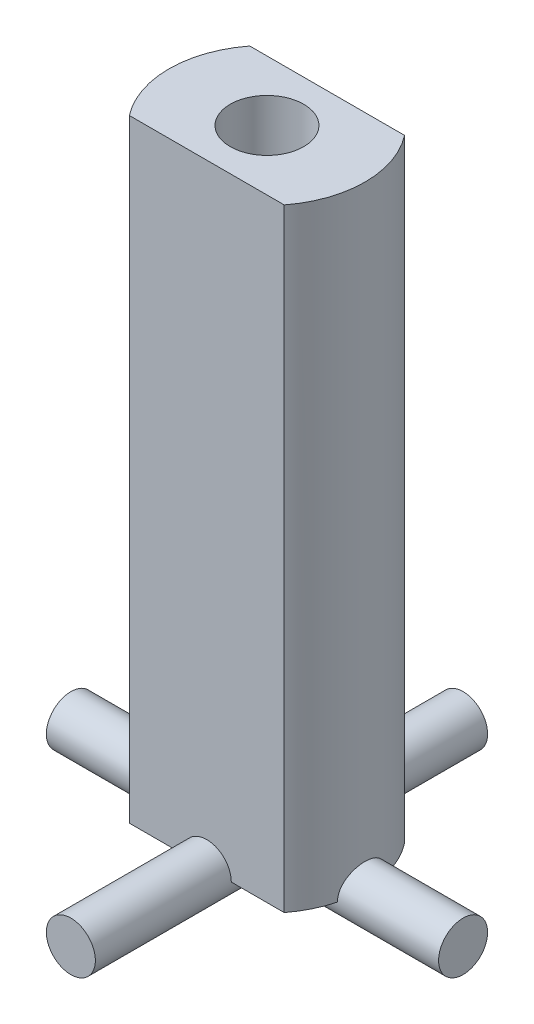
ISO-10303-21;
HEADER;
FILE_DESCRIPTION(('STEP AP214'),'2;1');
FILE_NAME('part.step','',(''),(''),'','','');
FILE_SCHEMA(('AUTOMOTIVE_DESIGN { 1 0 10303 214 1 1 1 1 }'));
ENDSEC;
DATA;
#1=APPLICATION_CONTEXT('core data for automotive mechanical design processes');
#2=APPLICATION_PROTOCOL_DEFINITION('international standard','automotive_design',2000,#1);
#3=PRODUCT_CONTEXT('',#1,'mechanical');
#4=PRODUCT('Part','Part','',(#3));
#5=PRODUCT_RELATED_PRODUCT_CATEGORY('part','',(#4));
#6=PRODUCT_DEFINITION_FORMATION('','',#4);
#7=PRODUCT_DEFINITION_CONTEXT('part definition',#1,'design');
#8=PRODUCT_DEFINITION('design','',#6,#7);
#9=PRODUCT_DEFINITION_SHAPE('','',#8);
#10=(LENGTH_UNIT() NAMED_UNIT(*) SI_UNIT(.MILLI.,.METRE.));
#11=(NAMED_UNIT(*) PLANE_ANGLE_UNIT() SI_UNIT($,.RADIAN.));
#12=(NAMED_UNIT(*) SI_UNIT($,.STERADIAN.) SOLID_ANGLE_UNIT());
#13=UNCERTAINTY_MEASURE_WITH_UNIT(LENGTH_MEASURE(1.E-05),#10,'distance_accuracy_value','');
#14=(GEOMETRIC_REPRESENTATION_CONTEXT(3) GLOBAL_UNCERTAINTY_ASSIGNED_CONTEXT((#13)) GLOBAL_UNIT_ASSIGNED_CONTEXT((#10,
#11,#12)) REPRESENTATION_CONTEXT('',''));
#15=CARTESIAN_POINT('',(0.,0.,0.));
#16=DIRECTION('',(0.,0.,1.));
#17=DIRECTION('',(1.,0.,0.));
#18=AXIS2_PLACEMENT_3D('',#15,#16,#17);
#19=CARTESIAN_POINT('',(0.,0.,0.));
#20=DIRECTION('',(0.,1.,0.));
#21=DIRECTION('',(0.,0.,1.));
#22=AXIS2_PLACEMENT_3D('',#19,#20,#21);
#23=PLANE('',#22);
#24=CARTESIAN_POINT('',(0.,0.,0.));
#25=DIRECTION('',(0.,1.,0.));
#26=DIRECTION('',(0.,0.,1.));
#27=AXIS2_PLACEMENT_3D('',#24,#25,#26);
#28=CIRCLE('',#27,2.);
#29=CARTESIAN_POINT('',(-1.93649167310371,0.,0.5));
#30=VERTEX_POINT('',#29);
#31=CARTESIAN_POINT('',(-1.57882487883139,0.,1.22772635468294));
#32=VERTEX_POINT('',#31);
#33=EDGE_CURVE('E146',#30,#32,#28,.T.);
#34=ORIENTED_EDGE('',*,*,#33,.F.);
#35=DIRECTION('',(1.,0.,0.));
#36=VECTOR('',#35,1.);
#37=CARTESIAN_POINT('',(-4.,0.,0.5));
#38=LINE('',#37,#36);
#39=CARTESIAN_POINT('',(-0.5,0.,0.5));
#40=VERTEX_POINT('',#39);
#41=EDGE_CURVE('E209',#30,#40,#38,.T.);
#42=ORIENTED_EDGE('',*,*,#41,.T.);
#43=DIRECTION('',(0.,0.,1.));
#44=VECTOR('',#43,1.);
#45=CARTESIAN_POINT('',(-0.5,0.,-4.));
#46=LINE('',#45,#44);
#47=CARTESIAN_POINT('',(-0.5,0.,1.22772635468294));
#48=VERTEX_POINT('',#47);
#49=EDGE_CURVE('E125',#40,#48,#46,.T.);
#50=ORIENTED_EDGE('',*,*,#49,.T.);
#51=DIRECTION('',(1.,0.,0.));
#52=VECTOR('',#51,1.);
#53=CARTESIAN_POINT('',(-1.57882487883139,0.,1.22772635468294));
#54=LINE('',#53,#52);
#55=EDGE_CURVE('E135',#32,#48,#54,.T.);
#56=ORIENTED_EDGE('',*,*,#55,.F.);
#57=EDGE_LOOP('',(#34,#42,#50,#56));
#58=FACE_BOUND('',#57,.T.);
#59=ADVANCED_FACE('F33',(#58),#23,.F.);
#60=DIRECTION('',(0.,0.,1.));
#61=VECTOR('',#60,1.);
#62=CARTESIAN_POINT('',(0.5,0.,-4.));
#63=LINE('',#62,#61);
#64=CARTESIAN_POINT('',(0.5,0.,1.22772635468294));
#65=VERTEX_POINT('',#64);
#66=CARTESIAN_POINT('',(0.5,0.,0.5));
#67=VERTEX_POINT('',#66);
#68=EDGE_CURVE('E116',#65,#67,#63,.F.);
#69=ORIENTED_EDGE('',*,*,#68,.T.);
#70=DIRECTION('',(1.,0.,0.));
#71=VECTOR('',#70,1.);
#72=CARTESIAN_POINT('',(-4.,0.,0.5));
#73=LINE('',#72,#71);
#74=CARTESIAN_POINT('',(1.93649167310371,0.,0.5));
#75=VERTEX_POINT('',#74);
#76=EDGE_CURVE('E194',#67,#75,#73,.T.);
#77=ORIENTED_EDGE('',*,*,#76,.T.);
#78=CARTESIAN_POINT('',(0.,0.,0.));
#79=DIRECTION('',(0.,1.,0.));
#80=DIRECTION('',(0.,0.,1.));
#81=AXIS2_PLACEMENT_3D('',#78,#79,#80);
#82=CIRCLE('',#81,2.);
#83=CARTESIAN_POINT('',(1.57882487883139,0.,1.22772635468294));
#84=VERTEX_POINT('',#83);
#85=EDGE_CURVE('E142',#84,#75,#82,.T.);
#86=ORIENTED_EDGE('',*,*,#85,.F.);
#87=EDGE_CURVE('E131',#65,#84,#54,.T.);
#88=ORIENTED_EDGE('',*,*,#87,.F.);
#89=EDGE_LOOP('',(#69,#77,#86,#88));
#90=FACE_BOUND('',#89,.T.);
#91=ADVANCED_FACE('F140',(#90),#23,.F.);
#92=CARTESIAN_POINT('',(0.,0.,-4.));
#93=DIRECTION('',(0.,0.,1.));
#94=DIRECTION('',(1.,0.,0.));
#95=AXIS2_PLACEMENT_3D('',#92,#93,#94);
#96=CYLINDRICAL_SURFACE('',#95,0.5);
#97=CARTESIAN_POINT('',(0.,0.,0.));
#98=DIRECTION('',(0.707106781186547,0.,0.707106781186547));
#99=DIRECTION('',(-0.707106781186547,0.,0.707106781186547));
#100=AXIS2_PLACEMENT_3D('',#97,#98,#99);
#101=ELLIPSE('',#100,0.707106781186547,0.5);
#102=CARTESIAN_POINT('',(0.,-0.5,0.));
#103=VERTEX_POINT('',#102);
#104=EDGE_CURVE('E11',#103,#40,#101,.F.);
#105=ORIENTED_EDGE('',*,*,#104,.F.);
#106=CARTESIAN_POINT('',(0.,0.,0.));
#107=DIRECTION('',(-0.707106781186547,0.,0.707106781186547));
#108=DIRECTION('',(0.707106781186547,0.,0.707106781186547));
#109=AXIS2_PLACEMENT_3D('',#106,#107,#108);
#110=ELLIPSE('',#109,0.707106781186547,0.5);
#111=EDGE_CURVE('E49',#67,#103,#110,.F.);
#112=ORIENTED_EDGE('',*,*,#111,.F.);
#113=ORIENTED_EDGE('',*,*,#68,.F.);
#114=CARTESIAN_POINT('',(0.,0.,1.22772635468294));
#115=DIRECTION('',(0.,0.,-1.));
#116=DIRECTION('',(-1.,0.,0.));
#117=AXIS2_PLACEMENT_3D('',#114,#115,#116);
#118=CIRCLE('',#117,0.5);
#119=EDGE_CURVE('E121',#48,#65,#118,.T.);
#120=ORIENTED_EDGE('',*,*,#119,.F.);
#121=ORIENTED_EDGE('',*,*,#49,.F.);
#122=EDGE_LOOP('',(#105,#112,#113,#120,#121));
#123=FACE_BOUND('',#122,.T.);
#124=CARTESIAN_POINT('',(0.,0.,4.));
#125=DIRECTION('',(0.,0.,1.));
#126=DIRECTION('',(1.,0.,0.));
#127=AXIS2_PLACEMENT_3D('',#124,#125,#126);
#128=CIRCLE('',#127,0.5);
#129=CARTESIAN_POINT('',(0.5,0.,4.));
#130=VERTEX_POINT('',#129);
#131=EDGE_CURVE('E264',#130,#130,#128,.T.);
#132=ORIENTED_EDGE('',*,*,#131,.F.);
#133=EDGE_LOOP('',(#132));
#134=FACE_BOUND('',#133,.T.);
#135=ADVANCED_FACE('F118',(#123,#134),#96,.T.);
#136=CARTESIAN_POINT('',(-0.5,0.,-1.22772635468294));
#137=VERTEX_POINT('',#136);
#138=CARTESIAN_POINT('',(-0.5,0.,-0.5));
#139=VERTEX_POINT('',#138);
#140=EDGE_CURVE('E167',#137,#139,#46,.T.);
#141=ORIENTED_EDGE('',*,*,#140,.T.);
#142=DIRECTION('',(1.,0.,0.));
#143=VECTOR('',#142,1.);
#144=CARTESIAN_POINT('',(-4.,0.,-0.5));
#145=LINE('',#144,#143);
#146=CARTESIAN_POINT('',(-1.93649167310371,0.,-0.5));
#147=VERTEX_POINT('',#146);
#148=EDGE_CURVE('E188',#139,#147,#145,.F.);
#149=ORIENTED_EDGE('',*,*,#148,.T.);
#150=CARTESIAN_POINT('',(-1.57882487883139,0.,-1.22772635468294));
#151=VERTEX_POINT('',#150);
#152=EDGE_CURVE('E143',#151,#147,#28,.T.);
#153=ORIENTED_EDGE('',*,*,#152,.F.);
#154=DIRECTION('',(-1.,0.,0.));
#155=VECTOR('',#154,1.);
#156=CARTESIAN_POINT('',(-1.57882487883139,0.,-1.22772635468294));
#157=LINE('',#156,#155);
#158=EDGE_CURVE('E151',#137,#151,#157,.T.);
#159=ORIENTED_EDGE('',*,*,#158,.F.);
#160=EDGE_LOOP('',(#141,#149,#153,#159));
#161=FACE_BOUND('',#160,.T.);
#162=ADVANCED_FACE('F246',(#161),#23,.F.);
#163=CARTESIAN_POINT('',(0.,12.5,0.));
#164=DIRECTION('',(0.,-1.,0.));
#165=DIRECTION('',(0.,0.,-1.));
#166=AXIS2_PLACEMENT_3D('',#163,#164,#165);
#167=CYLINDRICAL_SURFACE('',#166,2.);
#168=ORIENTED_EDGE('',*,*,#152,.T.);
#169=CARTESIAN_POINT('',(-1.93649167310371,0.,-0.5));
#170=CARTESIAN_POINT('',(-1.93646809909124,0.0276614121562544,-0.500025906431621));
#171=CARTESIAN_POINT('',(-1.93708375592469,0.0553055042815103,-0.497706322777899));
#172=CARTESIAN_POINT('',(-1.93941464849821,0.109739887238544,-0.488579665597411));
#173=CARTESIAN_POINT('',(-1.9411276483262,0.136531798195898,-0.481781716252031));
#174=CARTESIAN_POINT('',(-1.945475480511,0.188558773268007,-0.463901169259005));
#175=CARTESIAN_POINT('',(-1.94811022623865,0.213793983425288,-0.45281897425066));
#176=CARTESIAN_POINT('',(-1.95399611118734,0.262056680112295,-0.426707117448015));
#177=CARTESIAN_POINT('',(-1.95724741562981,0.28508357237504,-0.411676397136426));
#178=CARTESIAN_POINT('',(-1.96408119100223,0.328771677436081,-0.377742393498038));
#179=CARTESIAN_POINT('',(-1.96766892270874,0.349377372476071,-0.358768676638937));
#180=CARTESIAN_POINT('',(-1.97472555442199,0.387151115399325,-0.317637848004419));
#181=CARTESIAN_POINT('',(-1.97819443536059,0.404318613787283,-0.295480228345473));
#182=CARTESIAN_POINT('',(-1.98468090254635,0.434955481490317,-0.248228461253673));
#183=CARTESIAN_POINT('',(-1.98769152103382,0.448369942819498,-0.223097673260402));
#184=CARTESIAN_POINT('',(-1.99286173362731,0.470762372269824,-0.170851292328903));
#185=CARTESIAN_POINT('',(-1.99502149520363,0.479741213522365,-0.143736091220776));
#186=CARTESIAN_POINT('',(-1.99820949940827,0.492829495044053,-0.0888720550666934));
#187=CARTESIAN_POINT('',(-1.99925976434121,0.497033835851399,-0.061147161216717));
#188=CARTESIAN_POINT('',(-2.00018719091935,0.500751686131614,-0.00536638762557865));
#189=CARTESIAN_POINT('',(-2.00006450001105,0.500265785191619,0.0226894500714319));
#190=CARTESIAN_POINT('',(-1.99867618678583,0.494685018063944,0.0776762464302359));
#191=CARTESIAN_POINT('',(-1.99743599337532,0.489692691675245,0.104618350854968));
#192=CARTESIAN_POINT('',(-1.99398165319397,0.475405660433644,0.15726935555713));
#193=CARTESIAN_POINT('',(-1.99176746333087,0.466110765222443,0.182978201216019));
#194=CARTESIAN_POINT('',(-1.98657498880587,0.443399359657882,0.232703643008207));
#195=CARTESIAN_POINT('',(-1.98358996913694,0.429946302881758,0.256702814800034));
#196=CARTESIAN_POINT('',(-1.97717972771043,0.39932843508509,0.302138315616097));
#197=CARTESIAN_POINT('',(-1.97375443966622,0.382163064873885,0.32357425778144));
#198=CARTESIAN_POINT('',(-1.96672783011409,0.344060543958837,0.363884694853942));
#199=CARTESIAN_POINT('',(-1.96312425238837,0.323034181729958,0.382674551526982));
#200=CARTESIAN_POINT('',(-1.95623084142009,0.27808506653627,0.4164847875932));
#201=CARTESIAN_POINT('',(-1.95294109421498,0.254161523358256,0.431504135122553));
#202=CARTESIAN_POINT('',(-1.94703906793161,0.203927201088081,0.457402354642959));
#203=CARTESIAN_POINT('',(-1.94443053004568,0.177604267551949,0.468258508943629));
#204=CARTESIAN_POINT('',(-1.94023529403528,0.123441535790868,0.48535117592492));
#205=CARTESIAN_POINT('',(-1.93864706880718,0.0956040724250813,0.491594594606067));
#206=CARTESIAN_POINT('',(-1.93727645340762,0.056271309620548,0.496952317575468));
#207=CARTESIAN_POINT('',(-1.9369826155543,0.0450401483934094,0.498095395483354));
#208=CARTESIAN_POINT('',(-1.93659031244487,0.0225411050453399,0.499618378848697));
#209=CARTESIAN_POINT('',(-1.93649153109731,0.0112733120223556,0.499999519048023));
#210=CARTESIAN_POINT('',(-1.93649167310371,0.,0.5));
#211=B_SPLINE_CURVE_WITH_KNOTS('',3,(#169,#170,#171,#172,#173,#174,#175,#176,#177,#178,#179,
#180,#181,#182,#183,#184,#185,#186,#187,#188,#189,#190,#191,#192,#193,#194,#195,#196,#197,#198,
#199,#200,#201,#202,#203,#204,#205,#206,#207,#208,#209,#210),.UNSPECIFIED.,.F.,.F.,(4,2,2,2,2,2,
2,2,2,2,2,2,2,2,2,2,2,2,2,2,4),(0.,0.0828537139949826,0.165539142492815,0.248216801988721,
0.330916648299366,0.415245109649978,0.499587037705587,0.585105096427164,0.670606314598113,
0.754376568512614,0.838136292219185,0.920036888332368,1.00194110831518,1.08458670818787,
1.16724476575763,1.2521313086087,1.33704105684083,1.42240776174133,1.50764639863592,
1.54150340454923,1.57530549959435),.UNSPECIFIED.);
#212=EDGE_CURVE('E57',#147,#30,#211,.T.);
#213=ORIENTED_EDGE('',*,*,#212,.T.);
#214=ORIENTED_EDGE('',*,*,#33,.T.);
#215=DIRECTION('',(0.,-1.,0.));
#216=VECTOR('',#215,1.);
#217=CARTESIAN_POINT('',(-1.57882487883139,12.5,1.22772635468294));
#218=LINE('',#217,#216);
#219=CARTESIAN_POINT('',(-1.57882487883139,12.5,1.22772635468294));
#220=VERTEX_POINT('',#219);
#221=EDGE_CURVE('E165',#220,#32,#218,.T.);
#222=ORIENTED_EDGE('',*,*,#221,.F.);
#223=CARTESIAN_POINT('',(0.,12.5,0.));
#224=DIRECTION('',(0.,1.,0.));
#225=DIRECTION('',(0.,0.,1.));
#226=AXIS2_PLACEMENT_3D('',#223,#224,#225);
#227=CIRCLE('',#226,2.);
#228=CARTESIAN_POINT('',(-1.57882487883139,12.5,-1.22772635468294));
#229=VERTEX_POINT('',#228);
#230=EDGE_CURVE('E155',#229,#220,#227,.T.);
#231=ORIENTED_EDGE('',*,*,#230,.F.);
#232=DIRECTION('',(0.,-1.,0.));
#233=VECTOR('',#232,1.);
#234=CARTESIAN_POINT('',(-1.57882487883139,12.5,-1.22772635468294));
#235=LINE('',#234,#233);
#236=EDGE_CURVE('E156',#229,#151,#235,.T.);
#237=ORIENTED_EDGE('',*,*,#236,.T.);
#238=EDGE_LOOP('',(#168,#213,#214,#222,#231,#237));
#239=FACE_BOUND('',#238,.T.);
#240=ADVANCED_FACE('F35',(#239),#167,.T.);
#241=CARTESIAN_POINT('',(-1.57882487883139,12.5,1.22772635468294));
#242=DIRECTION('',(0.,0.,-1.));
#243=DIRECTION('',(-1.,0.,0.));
#244=AXIS2_PLACEMENT_3D('',#241,#242,#243);
#245=PLANE('',#244);
#246=ORIENTED_EDGE('',*,*,#55,.T.);
#247=ORIENTED_EDGE('',*,*,#119,.T.);
#248=ORIENTED_EDGE('',*,*,#87,.T.);
#249=DIRECTION('',(0.,-1.,0.));
#250=VECTOR('',#249,1.);
#251=CARTESIAN_POINT('',(1.57882487883139,12.5,1.22772635468294));
#252=LINE('',#251,#250);
#253=CARTESIAN_POINT('',(1.57882487883139,12.5,1.22772635468294));
#254=VERTEX_POINT('',#253);
#255=EDGE_CURVE('E163',#254,#84,#252,.T.);
#256=ORIENTED_EDGE('',*,*,#255,.F.);
#257=DIRECTION('',(1.,0.,0.));
#258=VECTOR('',#257,1.);
#259=CARTESIAN_POINT('',(-1.57882487883139,12.5,1.22772635468294));
#260=LINE('',#259,#258);
#261=EDGE_CURVE('E279',#220,#254,#260,.T.);
#262=ORIENTED_EDGE('',*,*,#261,.F.);
#263=ORIENTED_EDGE('',*,*,#221,.T.);
#264=EDGE_LOOP('',(#246,#247,#248,#256,#262,#263));
#265=FACE_BOUND('',#264,.T.);
#266=ADVANCED_FACE('F129',(#265),#245,.F.);
#267=CARTESIAN_POINT('',(0.,12.5,0.));
#268=DIRECTION('',(0.,-1.,0.));
#269=DIRECTION('',(0.,0.,-1.));
#270=AXIS2_PLACEMENT_3D('',#267,#268,#269);
#271=CYLINDRICAL_SURFACE('',#270,2.);
#272=ORIENTED_EDGE('',*,*,#85,.T.);
#273=CARTESIAN_POINT('',(1.93649167310371,0.,0.5));
#274=CARTESIAN_POINT('',(1.93646809909124,0.0276614121562544,0.500025906431621));
#275=CARTESIAN_POINT('',(1.93708375592469,0.0553055042815103,0.497706322777899));
#276=CARTESIAN_POINT('',(1.93941464849821,0.109739887238544,0.488579665597411));
#277=CARTESIAN_POINT('',(1.9411276483262,0.136531798195898,0.481781716252031));
#278=CARTESIAN_POINT('',(1.945475480511,0.188558773268007,0.463901169259005));
#279=CARTESIAN_POINT('',(1.94811022623865,0.213793983425288,0.45281897425066));
#280=CARTESIAN_POINT('',(1.95399611118734,0.262056680112295,0.426707117448015));
#281=CARTESIAN_POINT('',(1.95724741562981,0.28508357237504,0.411676397136426));
#282=CARTESIAN_POINT('',(1.96408119100223,0.328771677436081,0.377742393498038));
#283=CARTESIAN_POINT('',(1.96766892270874,0.349377372476071,0.358768676638937));
#284=CARTESIAN_POINT('',(1.97472555442199,0.387151115399325,0.317637848004419));
#285=CARTESIAN_POINT('',(1.97819443536059,0.404318613787283,0.295480228345473));
#286=CARTESIAN_POINT('',(1.98468090254635,0.434955481490317,0.248228461253673));
#287=CARTESIAN_POINT('',(1.98769152103382,0.448369942819498,0.223097673260402));
#288=CARTESIAN_POINT('',(1.99286173362731,0.470762372269824,0.170851292328903));
#289=CARTESIAN_POINT('',(1.99502149520363,0.479741213522365,0.143736091220776));
#290=CARTESIAN_POINT('',(1.99820949940827,0.492829495044053,0.0888720550666934));
#291=CARTESIAN_POINT('',(1.99925976434121,0.497033835851399,0.061147161216717));
#292=CARTESIAN_POINT('',(2.00018719091935,0.500751686131614,0.00536638762557865));
#293=CARTESIAN_POINT('',(2.00006450001105,0.500265785191619,-0.0226894500714319));
#294=CARTESIAN_POINT('',(1.99867618678583,0.494685018063944,-0.0776762464302359));
#295=CARTESIAN_POINT('',(1.99743599337532,0.489692691675245,-0.104618350854968));
#296=CARTESIAN_POINT('',(1.99398165319397,0.475405660433644,-0.15726935555713));
#297=CARTESIAN_POINT('',(1.99176746333087,0.466110765222443,-0.182978201216019));
#298=CARTESIAN_POINT('',(1.98657498880587,0.443399359657882,-0.232703643008207));
#299=CARTESIAN_POINT('',(1.98358996913694,0.429946302881758,-0.256702814800034));
#300=CARTESIAN_POINT('',(1.97717972771043,0.39932843508509,-0.302138315616097));
#301=CARTESIAN_POINT('',(1.97375443966622,0.382163064873885,-0.32357425778144));
#302=CARTESIAN_POINT('',(1.96672783011409,0.344060543958837,-0.363884694853942));
#303=CARTESIAN_POINT('',(1.96312425238837,0.323034181729958,-0.382674551526982));
#304=CARTESIAN_POINT('',(1.95623084142009,0.27808506653627,-0.4164847875932));
#305=CARTESIAN_POINT('',(1.95294109421498,0.254161523358256,-0.431504135122553));
#306=CARTESIAN_POINT('',(1.94703906793161,0.203927201088081,-0.457402354642959));
#307=CARTESIAN_POINT('',(1.94443053004568,0.177604267551949,-0.468258508943629));
#308=CARTESIAN_POINT('',(1.94023529403528,0.123441535790868,-0.48535117592492));
#309=CARTESIAN_POINT('',(1.93864706880718,0.0956040724250813,-0.491594594606067));
#310=CARTESIAN_POINT('',(1.93727645340762,0.056271309620548,-0.496952317575468));
#311=CARTESIAN_POINT('',(1.9369826155543,0.0450401483934094,-0.498095395483354));
#312=CARTESIAN_POINT('',(1.93659031244487,0.0225411050453399,-0.499618378848697));
#313=CARTESIAN_POINT('',(1.93649153109731,0.0112733120223556,-0.499999519048023));
#314=CARTESIAN_POINT('',(1.93649167310371,0.,-0.5));
#315=B_SPLINE_CURVE_WITH_KNOTS('',3,(#273,#274,#275,#276,#277,#278,#279,#280,#281,#282,#283,
#284,#285,#286,#287,#288,#289,#290,#291,#292,#293,#294,#295,#296,#297,#298,#299,#300,#301,#302,
#303,#304,#305,#306,#307,#308,#309,#310,#311,#312,#313,#314),.UNSPECIFIED.,.F.,.F.,(4,2,2,2,2,2,
2,2,2,2,2,2,2,2,2,2,2,2,2,2,4),(0.,0.0828537139949826,0.165539142492815,0.248216801988721,
0.330916648299366,0.415245109649978,0.499587037705587,0.585105096427164,0.670606314598113,
0.754376568512614,0.838136292219185,0.920036888332368,1.00194110831518,1.08458670818787,
1.16724476575763,1.2521313086087,1.33704105684083,1.42240776174133,1.50764639863592,
1.54150340454923,1.57530549959435),.UNSPECIFIED.);
#316=CARTESIAN_POINT('',(1.93649167310371,0.,-0.5));
#317=VERTEX_POINT('',#316);
#318=EDGE_CURVE('E191',#75,#317,#315,.T.);
#319=ORIENTED_EDGE('',*,*,#318,.T.);
#320=CARTESIAN_POINT('',(1.57882487883139,0.,-1.22772635468294));
#321=VERTEX_POINT('',#320);
#322=EDGE_CURVE('E145',#317,#321,#82,.T.);
#323=ORIENTED_EDGE('',*,*,#322,.T.);
#324=DIRECTION('',(0.,-1.,0.));
#325=VECTOR('',#324,1.);
#326=CARTESIAN_POINT('',(1.57882487883139,12.5,-1.22772635468294));
#327=LINE('',#326,#325);
#328=CARTESIAN_POINT('',(1.57882487883139,12.5,-1.22772635468294));
#329=VERTEX_POINT('',#328);
#330=EDGE_CURVE('E159',#329,#321,#327,.T.);
#331=ORIENTED_EDGE('',*,*,#330,.F.);
#332=CARTESIAN_POINT('',(0.,12.5,0.));
#333=DIRECTION('',(0.,1.,0.));
#334=DIRECTION('',(0.,0.,1.));
#335=AXIS2_PLACEMENT_3D('',#332,#333,#334);
#336=CIRCLE('',#335,2.);
#337=EDGE_CURVE('E281',#254,#329,#336,.T.);
#338=ORIENTED_EDGE('',*,*,#337,.F.);
#339=ORIENTED_EDGE('',*,*,#255,.T.);
#340=EDGE_LOOP('',(#272,#319,#323,#331,#338,#339));
#341=FACE_BOUND('',#340,.T.);
#342=ADVANCED_FACE('F248',(#341),#271,.T.);
#343=CARTESIAN_POINT('',(-1.57882487883139,12.5,-1.22772635468294));
#344=DIRECTION('',(0.,0.,1.));
#345=DIRECTION('',(1.,0.,0.));
#346=AXIS2_PLACEMENT_3D('',#343,#344,#345);
#347=PLANE('',#346);
#348=CARTESIAN_POINT('',(0.499999999999999,0.,-1.22772635468294));
#349=VERTEX_POINT('',#348);
#350=EDGE_CURVE('E152',#321,#349,#157,.T.);
#351=ORIENTED_EDGE('',*,*,#350,.T.);
#352=CARTESIAN_POINT('',(0.,0.,-1.22772635468294));
#353=DIRECTION('',(0.,0.,1.));
#354=DIRECTION('',(1.,0.,0.));
#355=AXIS2_PLACEMENT_3D('',#352,#353,#354);
#356=CIRCLE('',#355,0.5);
#357=EDGE_CURVE('E137',#349,#137,#356,.T.);
#358=ORIENTED_EDGE('',*,*,#357,.T.);
#359=ORIENTED_EDGE('',*,*,#158,.T.);
#360=ORIENTED_EDGE('',*,*,#236,.F.);
#361=DIRECTION('',(-1.,0.,0.));
#362=VECTOR('',#361,1.);
#363=CARTESIAN_POINT('',(-1.57882487883139,12.5,-1.22772635468294));
#364=LINE('',#363,#362);
#365=EDGE_CURVE('E160',#329,#229,#364,.T.);
#366=ORIENTED_EDGE('',*,*,#365,.F.);
#367=ORIENTED_EDGE('',*,*,#330,.T.);
#368=EDGE_LOOP('',(#351,#358,#359,#360,#366,#367));
#369=FACE_BOUND('',#368,.T.);
#370=ADVANCED_FACE('F241',(#369),#347,.F.);
#371=CARTESIAN_POINT('',(0.,12.5,0.));
#372=DIRECTION('',(0.,1.,0.));
#373=DIRECTION('',(0.,0.,1.));
#374=AXIS2_PLACEMENT_3D('',#371,#372,#373);
#375=PLANE('',#374);
#376=CARTESIAN_POINT('',(0.,12.5,0.));
#377=DIRECTION('',(0.,1.,0.));
#378=DIRECTION('',(0.,0.,1.));
#379=AXIS2_PLACEMENT_3D('',#376,#377,#378);
#380=CIRCLE('',#379,0.75);
#381=CARTESIAN_POINT('',(0.,12.5,0.75));
#382=VERTEX_POINT('',#381);
#383=EDGE_CURVE('E136',#382,#382,#380,.T.);
#384=ORIENTED_EDGE('',*,*,#383,.F.);
#385=EDGE_LOOP('',(#384));
#386=FACE_BOUND('',#385,.T.);
#387=ORIENTED_EDGE('',*,*,#230,.T.);
#388=ORIENTED_EDGE('',*,*,#261,.T.);
#389=ORIENTED_EDGE('',*,*,#337,.T.);
#390=ORIENTED_EDGE('',*,*,#365,.T.);
#391=EDGE_LOOP('',(#387,#388,#389,#390));
#392=FACE_BOUND('',#391,.T.);
#393=ADVANCED_FACE('F238',(#386,#392),#375,.T.);
#394=ORIENTED_EDGE('',*,*,#322,.F.);
#395=DIRECTION('',(1.,0.,0.));
#396=VECTOR('',#395,1.);
#397=CARTESIAN_POINT('',(-4.,0.,-0.5));
#398=LINE('',#397,#396);
#399=CARTESIAN_POINT('',(0.5,0.,-0.5));
#400=VERTEX_POINT('',#399);
#401=EDGE_CURVE('E178',#317,#400,#398,.F.);
#402=ORIENTED_EDGE('',*,*,#401,.T.);
#403=EDGE_CURVE('E126',#400,#349,#63,.F.);
#404=ORIENTED_EDGE('',*,*,#403,.T.);
#405=ORIENTED_EDGE('',*,*,#350,.F.);
#406=EDGE_LOOP('',(#394,#402,#404,#405));
#407=FACE_BOUND('',#406,.T.);
#408=ADVANCED_FACE('F236',(#407),#23,.F.);
#409=CARTESIAN_POINT('',(0.,8.5,0.));
#410=DIRECTION('',(0.,1.,0.));
#411=DIRECTION('',(0.,0.,1.));
#412=AXIS2_PLACEMENT_3D('',#409,#410,#411);
#413=CYLINDRICAL_SURFACE('',#412,0.75);
#414=CARTESIAN_POINT('',(0.,8.5,0.));
#415=DIRECTION('',(0.,1.,0.));
#416=DIRECTION('',(0.,0.,1.));
#417=AXIS2_PLACEMENT_3D('',#414,#415,#416);
#418=CIRCLE('',#417,0.75);
#419=CARTESIAN_POINT('',(0.,8.5,0.75));
#420=VERTEX_POINT('',#419);
#421=EDGE_CURVE('E263',#420,#420,#418,.T.);
#422=ORIENTED_EDGE('',*,*,#421,.F.);
#423=EDGE_LOOP('',(#422));
#424=FACE_BOUND('',#423,.T.);
#425=ORIENTED_EDGE('',*,*,#383,.T.);
#426=EDGE_LOOP('',(#425));
#427=FACE_BOUND('',#426,.T.);
#428=ADVANCED_FACE('F232',(#424,#427),#413,.F.);
#429=CARTESIAN_POINT('',(0.,8.5,0.));
#430=DIRECTION('',(0.,1.,0.));
#431=DIRECTION('',(0.,0.,1.));
#432=AXIS2_PLACEMENT_3D('',#429,#430,#431);
#433=PLANE('',#432);
#434=ORIENTED_EDGE('',*,*,#421,.T.);
#435=EDGE_LOOP('',(#434));
#436=FACE_BOUND('',#435,.T.);
#437=ADVANCED_FACE('F229',(#436),#433,.T.);
#438=CARTESIAN_POINT('',(0.,0.,0.));
#439=DIRECTION('',(0.707106781186547,0.,0.707106781186547));
#440=DIRECTION('',(-0.707106781186547,0.,0.707106781186547));
#441=AXIS2_PLACEMENT_3D('',#438,#439,#440);
#442=ELLIPSE('',#441,0.707106781186547,0.5);
#443=EDGE_CURVE('E42',#103,#400,#442,.T.);
#444=ORIENTED_EDGE('',*,*,#443,.F.);
#445=CARTESIAN_POINT('',(0.,0.,0.));
#446=DIRECTION('',(-0.707106781186547,0.,0.707106781186547));
#447=DIRECTION('',(0.707106781186547,0.,0.707106781186547));
#448=AXIS2_PLACEMENT_3D('',#445,#446,#447);
#449=ELLIPSE('',#448,0.707106781186547,0.5);
#450=EDGE_CURVE('E171',#139,#103,#449,.T.);
#451=ORIENTED_EDGE('',*,*,#450,.F.);
#452=ORIENTED_EDGE('',*,*,#140,.F.);
#453=ORIENTED_EDGE('',*,*,#357,.F.);
#454=ORIENTED_EDGE('',*,*,#403,.F.);
#455=EDGE_LOOP('',(#444,#451,#452,#453,#454));
#456=FACE_BOUND('',#455,.T.);
#457=CARTESIAN_POINT('',(0.,0.,-4.));
#458=DIRECTION('',(0.,0.,1.));
#459=DIRECTION('',(1.,0.,0.));
#460=AXIS2_PLACEMENT_3D('',#457,#458,#459);
#461=CIRCLE('',#460,0.5);
#462=CARTESIAN_POINT('',(0.5,0.,-4.));
#463=VERTEX_POINT('',#462);
#464=EDGE_CURVE('E266',#463,#463,#461,.T.);
#465=ORIENTED_EDGE('',*,*,#464,.T.);
#466=EDGE_LOOP('',(#465));
#467=FACE_BOUND('',#466,.T.);
#468=ADVANCED_FACE('F181',(#456,#467),#96,.T.);
#469=CARTESIAN_POINT('',(0.,0.,-4.));
#470=DIRECTION('',(0.,0.,1.));
#471=DIRECTION('',(1.,0.,0.));
#472=AXIS2_PLACEMENT_3D('',#469,#470,#471);
#473=PLANE('',#472);
#474=ORIENTED_EDGE('',*,*,#464,.F.);
#475=EDGE_LOOP('',(#474));
#476=FACE_BOUND('',#475,.T.);
#477=ADVANCED_FACE('F222',(#476),#473,.F.);
#478=CARTESIAN_POINT('',(0.,0.,4.));
#479=DIRECTION('',(0.,0.,1.));
#480=DIRECTION('',(1.,0.,0.));
#481=AXIS2_PLACEMENT_3D('',#478,#479,#480);
#482=PLANE('',#481);
#483=ORIENTED_EDGE('',*,*,#131,.T.);
#484=EDGE_LOOP('',(#483));
#485=FACE_BOUND('',#484,.T.);
#486=ADVANCED_FACE('F218',(#485),#482,.T.);
#487=CARTESIAN_POINT('',(4.,0.,0.));
#488=DIRECTION('',(1.,0.,0.));
#489=DIRECTION('',(0.,0.,-1.));
#490=AXIS2_PLACEMENT_3D('',#487,#488,#489);
#491=PLANE('',#490);
#492=CARTESIAN_POINT('',(4.,0.,0.));
#493=DIRECTION('',(1.,0.,0.));
#494=DIRECTION('',(0.,0.,-1.));
#495=AXIS2_PLACEMENT_3D('',#492,#493,#494);
#496=CIRCLE('',#495,0.5);
#497=CARTESIAN_POINT('',(4.,0.,-0.5));
#498=VERTEX_POINT('',#497);
#499=EDGE_CURVE('E400',#498,#498,#496,.T.);
#500=ORIENTED_EDGE('',*,*,#499,.T.);
#501=EDGE_LOOP('',(#500));
#502=FACE_BOUND('',#501,.T.);
#503=ADVANCED_FACE('F215',(#502),#491,.T.);
#504=CARTESIAN_POINT('',(-4.,0.,0.));
#505=DIRECTION('',(1.,0.,0.));
#506=DIRECTION('',(0.,0.,-1.));
#507=AXIS2_PLACEMENT_3D('',#504,#505,#506);
#508=CYLINDRICAL_SURFACE('',#507,0.5);
#509=ORIENTED_EDGE('',*,*,#111,.T.);
#510=ORIENTED_EDGE('',*,*,#443,.T.);
#511=ORIENTED_EDGE('',*,*,#401,.F.);
#512=ORIENTED_EDGE('',*,*,#318,.F.);
#513=ORIENTED_EDGE('',*,*,#76,.F.);
#514=EDGE_LOOP('',(#509,#510,#511,#512,#513));
#515=FACE_BOUND('',#514,.T.);
#516=ORIENTED_EDGE('',*,*,#499,.F.);
#517=EDGE_LOOP('',(#516));
#518=FACE_BOUND('',#517,.T.);
#519=ADVANCED_FACE('F175',(#515,#518),#508,.T.);
#520=CARTESIAN_POINT('',(-4.,0.,0.));
#521=DIRECTION('',(1.,0.,0.));
#522=DIRECTION('',(0.,0.,-1.));
#523=AXIS2_PLACEMENT_3D('',#520,#521,#522);
#524=CIRCLE('',#523,0.5);
#525=CARTESIAN_POINT('',(-4.,0.,-0.5));
#526=VERTEX_POINT('',#525);
#527=EDGE_CURVE('E399',#526,#526,#524,.T.);
#528=ORIENTED_EDGE('',*,*,#527,.T.);
#529=EDGE_LOOP('',(#528));
#530=FACE_BOUND('',#529,.T.);
#531=ORIENTED_EDGE('',*,*,#450,.T.);
#532=ORIENTED_EDGE('',*,*,#104,.T.);
#533=ORIENTED_EDGE('',*,*,#41,.F.);
#534=ORIENTED_EDGE('',*,*,#212,.F.);
#535=ORIENTED_EDGE('',*,*,#148,.F.);
#536=EDGE_LOOP('',(#531,#532,#533,#534,#535));
#537=FACE_BOUND('',#536,.T.);
#538=ADVANCED_FACE('F186',(#530,#537),#508,.T.);
#539=CARTESIAN_POINT('',(-4.,0.,0.));
#540=DIRECTION('',(1.,0.,0.));
#541=DIRECTION('',(0.,0.,-1.));
#542=AXIS2_PLACEMENT_3D('',#539,#540,#541);
#543=PLANE('',#542);
#544=ORIENTED_EDGE('',*,*,#527,.F.);
#545=EDGE_LOOP('',(#544));
#546=FACE_BOUND('',#545,.T.);
#547=ADVANCED_FACE('F216',(#546),#543,.F.);
#548=CLOSED_SHELL('',(#59,#91,#135,#162,#240,#266,#342,#370,#393,#408,#428,#437,#468,#477,#486,
#503,#519,#538,#547));
#549=MANIFOLD_SOLID_BREP('B2',#548);
#550=ADVANCED_BREP_SHAPE_REPRESENTATION('',(#18,#549),#14);
#551=SHAPE_DEFINITION_REPRESENTATION(#9,#550);
ENDSEC;
END-ISO-10303-21;
